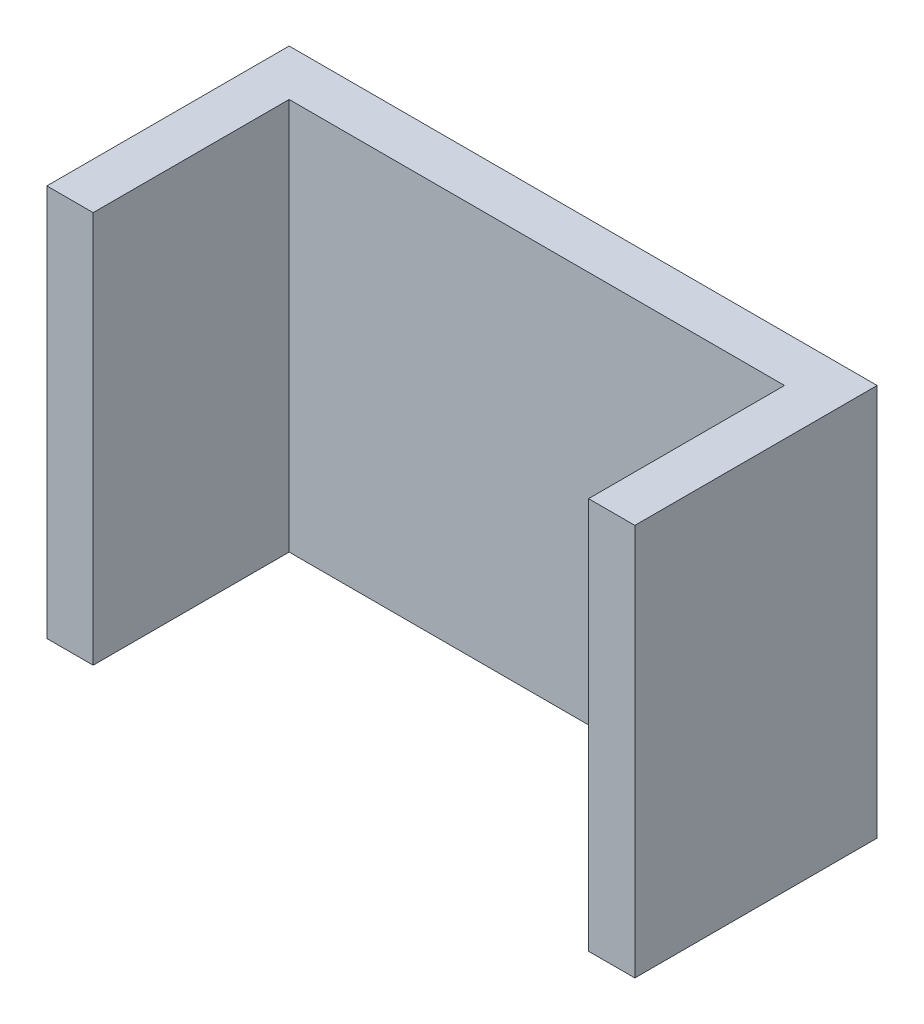
ISO-10303-21;
HEADER;
FILE_DESCRIPTION(('STEP AP214'),'2;1');
FILE_NAME('part.step','',(''),(''),'','','');
FILE_SCHEMA(('AUTOMOTIVE_DESIGN { 1 0 10303 214 1 1 1 1 }'));
ENDSEC;
DATA;
#1=APPLICATION_CONTEXT('core data for automotive mechanical design processes');
#2=APPLICATION_PROTOCOL_DEFINITION('international standard','automotive_design',2000,#1);
#3=PRODUCT_CONTEXT('',#1,'mechanical');
#4=PRODUCT('Part','Part','',(#3));
#5=PRODUCT_RELATED_PRODUCT_CATEGORY('part','',(#4));
#6=PRODUCT_DEFINITION_FORMATION('','',#4);
#7=PRODUCT_DEFINITION_CONTEXT('part definition',#1,'design');
#8=PRODUCT_DEFINITION('design','',#6,#7);
#9=PRODUCT_DEFINITION_SHAPE('','',#8);
#10=(LENGTH_UNIT() NAMED_UNIT(*) SI_UNIT(.MILLI.,.METRE.));
#11=(NAMED_UNIT(*) PLANE_ANGLE_UNIT() SI_UNIT($,.RADIAN.));
#12=(NAMED_UNIT(*) SI_UNIT($,.STERADIAN.) SOLID_ANGLE_UNIT());
#13=UNCERTAINTY_MEASURE_WITH_UNIT(LENGTH_MEASURE(1.E-05),#10,'distance_accuracy_value','');
#14=(GEOMETRIC_REPRESENTATION_CONTEXT(3) GLOBAL_UNCERTAINTY_ASSIGNED_CONTEXT((#13)) GLOBAL_UNIT_ASSIGNED_CONTEXT((#10,
#11,#12)) REPRESENTATION_CONTEXT('',''));
#15=CARTESIAN_POINT('',(0.,0.,0.));
#16=DIRECTION('',(0.,0.,1.));
#17=DIRECTION('',(1.,0.,0.));
#18=AXIS2_PLACEMENT_3D('',#15,#16,#17);
#19=CARTESIAN_POINT('',(-32.1,50.8,0.));
#20=DIRECTION('',(1.,0.,0.));
#21=DIRECTION('',(0.,0.,-1.));
#22=AXIS2_PLACEMENT_3D('',#19,#20,#21);
#23=PLANE('',#22);
#24=DIRECTION('',(0.,0.,1.));
#25=VECTOR('',#24,1.);
#26=CARTESIAN_POINT('',(-32.1,0.,0.));
#27=LINE('',#26,#25);
#28=CARTESIAN_POINT('',(-32.1,0.,3.));
#29=VERTEX_POINT('',#28);
#30=CARTESIAN_POINT('',(-32.1,0.,28.4));
#31=VERTEX_POINT('',#30);
#32=EDGE_CURVE('E130',#29,#31,#27,.T.);
#33=ORIENTED_EDGE('',*,*,#32,.F.);
#34=DIRECTION('',(0.,-1.,0.));
#35=VECTOR('',#34,1.);
#36=CARTESIAN_POINT('',(-32.1,50.8,3.));
#37=LINE('',#36,#35);
#38=CARTESIAN_POINT('',(-32.1,50.8,3.));
#39=VERTEX_POINT('',#38);
#40=EDGE_CURVE('E11',#39,#29,#37,.T.);
#41=ORIENTED_EDGE('',*,*,#40,.F.);
#42=DIRECTION('',(0.,0.,1.));
#43=VECTOR('',#42,1.);
#44=CARTESIAN_POINT('',(-32.1,50.8,0.));
#45=LINE('',#44,#43);
#46=CARTESIAN_POINT('',(-32.1,50.8,28.4));
#47=VERTEX_POINT('',#46);
#48=EDGE_CURVE('E148',#39,#47,#45,.T.);
#49=ORIENTED_EDGE('',*,*,#48,.T.);
#50=DIRECTION('',(0.,-1.,0.));
#51=VECTOR('',#50,1.);
#52=CARTESIAN_POINT('',(-32.1,50.8,28.4));
#53=LINE('',#52,#51);
#54=EDGE_CURVE('E85',#47,#31,#53,.T.);
#55=ORIENTED_EDGE('',*,*,#54,.T.);
#56=EDGE_LOOP('',(#33,#41,#49,#55));
#57=FACE_BOUND('',#56,.T.);
#58=ADVANCED_FACE('F35',(#57),#23,.T.);
#59=CARTESIAN_POINT('',(0.,50.8,3.));
#60=DIRECTION('',(0.,0.,-1.));
#61=DIRECTION('',(-1.,0.,0.));
#62=AXIS2_PLACEMENT_3D('',#59,#60,#61);
#63=PLANE('',#62);
#64=DIRECTION('',(1.,0.,0.));
#65=VECTOR('',#64,1.);
#66=CARTESIAN_POINT('',(0.,0.,3.));
#67=LINE('',#66,#65);
#68=CARTESIAN_POINT('',(32.1,0.,3.));
#69=VERTEX_POINT('',#68);
#70=EDGE_CURVE('E133',#29,#69,#67,.T.);
#71=ORIENTED_EDGE('',*,*,#70,.T.);
#72=DIRECTION('',(0.,-1.,0.));
#73=VECTOR('',#72,1.);
#74=CARTESIAN_POINT('',(32.1,50.8,3.));
#75=LINE('',#74,#73);
#76=CARTESIAN_POINT('',(32.1,50.8,3.));
#77=VERTEX_POINT('',#76);
#78=EDGE_CURVE('E43',#77,#69,#75,.T.);
#79=ORIENTED_EDGE('',*,*,#78,.F.);
#80=DIRECTION('',(1.,0.,0.));
#81=VECTOR('',#80,1.);
#82=CARTESIAN_POINT('',(0.,50.8,3.));
#83=LINE('',#82,#81);
#84=EDGE_CURVE('E172',#39,#77,#83,.T.);
#85=ORIENTED_EDGE('',*,*,#84,.F.);
#86=ORIENTED_EDGE('',*,*,#40,.T.);
#87=EDGE_LOOP('',(#71,#79,#85,#86));
#88=FACE_BOUND('',#87,.T.);
#89=ADVANCED_FACE('F176',(#88),#63,.F.);
#90=CARTESIAN_POINT('',(32.1,50.8,0.));
#91=DIRECTION('',(1.,0.,0.));
#92=DIRECTION('',(0.,0.,-1.));
#93=AXIS2_PLACEMENT_3D('',#90,#91,#92);
#94=PLANE('',#93);
#95=DIRECTION('',(0.,0.,1.));
#96=VECTOR('',#95,1.);
#97=CARTESIAN_POINT('',(32.1,0.,0.));
#98=LINE('',#97,#96);
#99=CARTESIAN_POINT('',(32.1,0.,28.4));
#100=VERTEX_POINT('',#99);
#101=EDGE_CURVE('E135',#69,#100,#98,.T.);
#102=ORIENTED_EDGE('',*,*,#101,.T.);
#103=DIRECTION('',(0.,-1.,0.));
#104=VECTOR('',#103,1.);
#105=CARTESIAN_POINT('',(32.1,50.8,28.4));
#106=LINE('',#105,#104);
#107=CARTESIAN_POINT('',(32.1,50.8,28.4));
#108=VERTEX_POINT('',#107);
#109=EDGE_CURVE('E154',#108,#100,#106,.T.);
#110=ORIENTED_EDGE('',*,*,#109,.F.);
#111=DIRECTION('',(0.,0.,1.));
#112=VECTOR('',#111,1.);
#113=CARTESIAN_POINT('',(32.1,50.8,0.));
#114=LINE('',#113,#112);
#115=EDGE_CURVE('E162',#77,#108,#114,.T.);
#116=ORIENTED_EDGE('',*,*,#115,.F.);
#117=ORIENTED_EDGE('',*,*,#78,.T.);
#118=EDGE_LOOP('',(#102,#110,#116,#117));
#119=FACE_BOUND('',#118,.T.);
#120=ADVANCED_FACE('F160',(#119),#94,.F.);
#121=CARTESIAN_POINT('',(0.,50.8,28.4));
#122=DIRECTION('',(0.,0.,1.));
#123=DIRECTION('',(1.,0.,0.));
#124=AXIS2_PLACEMENT_3D('',#121,#122,#123);
#125=PLANE('',#124);
#126=DIRECTION('',(-1.,0.,0.));
#127=VECTOR('',#126,1.);
#128=CARTESIAN_POINT('',(0.,0.,28.4));
#129=LINE('',#128,#127);
#130=CARTESIAN_POINT('',(38.1,0.,28.4));
#131=VERTEX_POINT('',#130);
#132=EDGE_CURVE('E138',#131,#100,#129,.T.);
#133=ORIENTED_EDGE('',*,*,#132,.F.);
#134=DIRECTION('',(0.,-1.,0.));
#135=VECTOR('',#134,1.);
#136=CARTESIAN_POINT('',(38.1,50.8,28.4));
#137=LINE('',#136,#135);
#138=CARTESIAN_POINT('',(38.1,50.8,28.4));
#139=VERTEX_POINT('',#138);
#140=EDGE_CURVE('E152',#139,#131,#137,.T.);
#141=ORIENTED_EDGE('',*,*,#140,.F.);
#142=DIRECTION('',(-1.,0.,0.));
#143=VECTOR('',#142,1.);
#144=CARTESIAN_POINT('',(0.,50.8,28.4));
#145=LINE('',#144,#143);
#146=EDGE_CURVE('E125',#139,#108,#145,.T.);
#147=ORIENTED_EDGE('',*,*,#146,.T.);
#148=ORIENTED_EDGE('',*,*,#109,.T.);
#149=EDGE_LOOP('',(#133,#141,#147,#148));
#150=FACE_BOUND('',#149,.T.);
#151=ADVANCED_FACE('F170',(#150),#125,.T.);
#152=CARTESIAN_POINT('',(38.1,50.8,0.));
#153=DIRECTION('',(-1.,0.,0.));
#154=DIRECTION('',(0.,0.,1.));
#155=AXIS2_PLACEMENT_3D('',#152,#153,#154);
#156=PLANE('',#155);
#157=DIRECTION('',(0.,0.,-1.));
#158=VECTOR('',#157,1.);
#159=CARTESIAN_POINT('',(38.1,0.,0.));
#160=LINE('',#159,#158);
#161=CARTESIAN_POINT('',(38.1,0.,-3.));
#162=VERTEX_POINT('',#161);
#163=EDGE_CURVE('E141',#131,#162,#160,.T.);
#164=ORIENTED_EDGE('',*,*,#163,.T.);
#165=DIRECTION('',(0.,-1.,0.));
#166=VECTOR('',#165,1.);
#167=CARTESIAN_POINT('',(38.1,50.8,-3.));
#168=LINE('',#167,#166);
#169=CARTESIAN_POINT('',(38.1,50.8,-3.));
#170=VERTEX_POINT('',#169);
#171=EDGE_CURVE('E113',#170,#162,#168,.T.);
#172=ORIENTED_EDGE('',*,*,#171,.F.);
#173=DIRECTION('',(0.,0.,-1.));
#174=VECTOR('',#173,1.);
#175=CARTESIAN_POINT('',(38.1,50.8,0.));
#176=LINE('',#175,#174);
#177=EDGE_CURVE('E122',#139,#170,#176,.T.);
#178=ORIENTED_EDGE('',*,*,#177,.F.);
#179=ORIENTED_EDGE('',*,*,#140,.T.);
#180=EDGE_LOOP('',(#164,#172,#178,#179));
#181=FACE_BOUND('',#180,.T.);
#182=ADVANCED_FACE('F186',(#181),#156,.F.);
#183=CARTESIAN_POINT('',(0.,50.8,-3.));
#184=DIRECTION('',(0.,0.,-1.));
#185=DIRECTION('',(-1.,0.,0.));
#186=AXIS2_PLACEMENT_3D('',#183,#184,#185);
#187=PLANE('',#186);
#188=DIRECTION('',(1.,0.,0.));
#189=VECTOR('',#188,1.);
#190=CARTESIAN_POINT('',(0.,0.,-3.));
#191=LINE('',#190,#189);
#192=CARTESIAN_POINT('',(-38.1,0.,-3.));
#193=VERTEX_POINT('',#192);
#194=EDGE_CURVE('E112',#193,#162,#191,.T.);
#195=ORIENTED_EDGE('',*,*,#194,.F.);
#196=DIRECTION('',(0.,-1.,0.));
#197=VECTOR('',#196,1.);
#198=CARTESIAN_POINT('',(-38.1,50.8,-3.));
#199=LINE('',#198,#197);
#200=CARTESIAN_POINT('',(-38.1,50.8,-3.));
#201=VERTEX_POINT('',#200);
#202=EDGE_CURVE('E106',#201,#193,#199,.T.);
#203=ORIENTED_EDGE('',*,*,#202,.F.);
#204=DIRECTION('',(1.,0.,0.));
#205=VECTOR('',#204,1.);
#206=CARTESIAN_POINT('',(0.,50.8,-3.));
#207=LINE('',#206,#205);
#208=EDGE_CURVE('E110',#201,#170,#207,.T.);
#209=ORIENTED_EDGE('',*,*,#208,.T.);
#210=ORIENTED_EDGE('',*,*,#171,.T.);
#211=EDGE_LOOP('',(#195,#203,#209,#210));
#212=FACE_BOUND('',#211,.T.);
#213=ADVANCED_FACE('F108',(#212),#187,.T.);
#214=CARTESIAN_POINT('',(-38.1,50.8,0.));
#215=DIRECTION('',(1.,0.,0.));
#216=DIRECTION('',(0.,0.,-1.));
#217=AXIS2_PLACEMENT_3D('',#214,#215,#216);
#218=PLANE('',#217);
#219=DIRECTION('',(0.,0.,1.));
#220=VECTOR('',#219,1.);
#221=CARTESIAN_POINT('',(-38.1,0.,0.));
#222=LINE('',#221,#220);
#223=CARTESIAN_POINT('',(-38.1,0.,28.4));
#224=VERTEX_POINT('',#223);
#225=EDGE_CURVE('E78',#193,#224,#222,.T.);
#226=ORIENTED_EDGE('',*,*,#225,.T.);
#227=DIRECTION('',(0.,-1.,0.));
#228=VECTOR('',#227,1.);
#229=CARTESIAN_POINT('',(-38.1,50.8,28.4));
#230=LINE('',#229,#228);
#231=CARTESIAN_POINT('',(-38.1,50.8,28.4));
#232=VERTEX_POINT('',#231);
#233=EDGE_CURVE('E114',#232,#224,#230,.T.);
#234=ORIENTED_EDGE('',*,*,#233,.F.);
#235=DIRECTION('',(0.,0.,1.));
#236=VECTOR('',#235,1.);
#237=CARTESIAN_POINT('',(-38.1,50.8,0.));
#238=LINE('',#237,#236);
#239=EDGE_CURVE('E116',#201,#232,#238,.T.);
#240=ORIENTED_EDGE('',*,*,#239,.F.);
#241=ORIENTED_EDGE('',*,*,#202,.T.);
#242=EDGE_LOOP('',(#226,#234,#240,#241));
#243=FACE_BOUND('',#242,.T.);
#244=ADVANCED_FACE('F117',(#243),#218,.F.);
#245=CARTESIAN_POINT('',(0.,50.8,28.4));
#246=DIRECTION('',(0.,0.,-1.));
#247=DIRECTION('',(-1.,0.,0.));
#248=AXIS2_PLACEMENT_3D('',#245,#246,#247);
#249=PLANE('',#248);
#250=DIRECTION('',(1.,0.,0.));
#251=VECTOR('',#250,1.);
#252=CARTESIAN_POINT('',(0.,0.,28.4));
#253=LINE('',#252,#251);
#254=EDGE_CURVE('E146',#224,#31,#253,.T.);
#255=ORIENTED_EDGE('',*,*,#254,.T.);
#256=ORIENTED_EDGE('',*,*,#54,.F.);
#257=DIRECTION('',(1.,0.,0.));
#258=VECTOR('',#257,1.);
#259=CARTESIAN_POINT('',(0.,50.8,28.4));
#260=LINE('',#259,#258);
#261=EDGE_CURVE('E51',#232,#47,#260,.T.);
#262=ORIENTED_EDGE('',*,*,#261,.F.);
#263=ORIENTED_EDGE('',*,*,#233,.T.);
#264=EDGE_LOOP('',(#255,#256,#262,#263));
#265=FACE_BOUND('',#264,.T.);
#266=ADVANCED_FACE('F194',(#265),#249,.F.);
#267=CARTESIAN_POINT('',(0.,50.8,0.));
#268=DIRECTION('',(0.,1.,0.));
#269=DIRECTION('',(0.,0.,1.));
#270=AXIS2_PLACEMENT_3D('',#267,#268,#269);
#271=PLANE('',#270);
#272=ORIENTED_EDGE('',*,*,#48,.F.);
#273=ORIENTED_EDGE('',*,*,#84,.T.);
#274=ORIENTED_EDGE('',*,*,#115,.T.);
#275=ORIENTED_EDGE('',*,*,#146,.F.);
#276=ORIENTED_EDGE('',*,*,#177,.T.);
#277=ORIENTED_EDGE('',*,*,#208,.F.);
#278=ORIENTED_EDGE('',*,*,#239,.T.);
#279=ORIENTED_EDGE('',*,*,#261,.T.);
#280=EDGE_LOOP('',(#272,#273,#274,#275,#276,#277,#278,#279));
#281=FACE_BOUND('',#280,.T.);
#282=ADVANCED_FACE('F119',(#281),#271,.T.);
#283=CARTESIAN_POINT('',(0.,0.,0.));
#284=DIRECTION('',(0.,1.,0.));
#285=DIRECTION('',(0.,0.,1.));
#286=AXIS2_PLACEMENT_3D('',#283,#284,#285);
#287=PLANE('',#286);
#288=ORIENTED_EDGE('',*,*,#32,.T.);
#289=ORIENTED_EDGE('',*,*,#254,.F.);
#290=ORIENTED_EDGE('',*,*,#225,.F.);
#291=ORIENTED_EDGE('',*,*,#194,.T.);
#292=ORIENTED_EDGE('',*,*,#163,.F.);
#293=ORIENTED_EDGE('',*,*,#132,.T.);
#294=ORIENTED_EDGE('',*,*,#101,.F.);
#295=ORIENTED_EDGE('',*,*,#70,.F.);
#296=EDGE_LOOP('',(#288,#289,#290,#291,#292,#293,#294,#295));
#297=FACE_BOUND('',#296,.T.);
#298=ADVANCED_FACE('F166',(#297),#287,.F.);
#299=CLOSED_SHELL('',(#58,#89,#120,#151,#182,#213,#244,#266,#282,#298));
#300=MANIFOLD_SOLID_BREP('B2',#299);
#301=ADVANCED_BREP_SHAPE_REPRESENTATION('',(#18,#300),#14);
#302=SHAPE_DEFINITION_REPRESENTATION(#9,#301);
ENDSEC;
END-ISO-10303-21;
